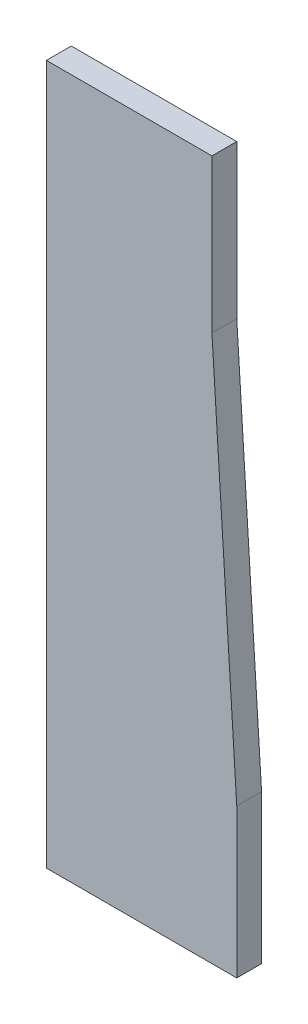
ISO-10303-21;
HEADER;
FILE_DESCRIPTION(('STEP AP214'),'2;1');
FILE_NAME('part.step','',(''),(''),'','','');
FILE_SCHEMA(('AUTOMOTIVE_DESIGN { 1 0 10303 214 1 1 1 1 }'));
ENDSEC;
DATA;
#1=APPLICATION_CONTEXT('core data for automotive mechanical design processes');
#2=APPLICATION_PROTOCOL_DEFINITION('international standard','automotive_design',2000,#1);
#3=PRODUCT_CONTEXT('',#1,'mechanical');
#4=PRODUCT('Part','Part','',(#3));
#5=PRODUCT_RELATED_PRODUCT_CATEGORY('part','',(#4));
#6=PRODUCT_DEFINITION_FORMATION('','',#4);
#7=PRODUCT_DEFINITION_CONTEXT('part definition',#1,'design');
#8=PRODUCT_DEFINITION('design','',#6,#7);
#9=PRODUCT_DEFINITION_SHAPE('','',#8);
#10=(LENGTH_UNIT() NAMED_UNIT(*) SI_UNIT(.MILLI.,.METRE.));
#11=(NAMED_UNIT(*) PLANE_ANGLE_UNIT() SI_UNIT($,.RADIAN.));
#12=(NAMED_UNIT(*) SI_UNIT($,.STERADIAN.) SOLID_ANGLE_UNIT());
#13=UNCERTAINTY_MEASURE_WITH_UNIT(LENGTH_MEASURE(1.E-05),#10,'distance_accuracy_value','');
#14=(GEOMETRIC_REPRESENTATION_CONTEXT(3) GLOBAL_UNCERTAINTY_ASSIGNED_CONTEXT((#13)) GLOBAL_UNIT_ASSIGNED_CONTEXT((#10,
#11,#12)) REPRESENTATION_CONTEXT('',''));
#15=CARTESIAN_POINT('',(0.,0.,0.));
#16=DIRECTION('',(0.,0.,1.));
#17=DIRECTION('',(1.,0.,0.));
#18=AXIS2_PLACEMENT_3D('',#15,#16,#17);
#19=CARTESIAN_POINT('',(209.03946,-5040.33140744906,19.05));
#20=DIRECTION('',(0.,-1.,0.));
#21=DIRECTION('',(0.,0.,-1.));
#22=AXIS2_PLACEMENT_3D('',#19,#20,#21);
#23=PLANE('',#22);
#24=DIRECTION('',(-1.,0.,0.));
#25=VECTOR('',#24,1.);
#26=CARTESIAN_POINT('',(209.03946,-5040.33140744906,0.));
#27=LINE('',#26,#25);
#28=CARTESIAN_POINT('',(209.03946,-5040.33140744906,0.));
#29=VERTEX_POINT('',#28);
#30=CARTESIAN_POINT('',(82.03946,-5040.33140744906,0.));
#31=VERTEX_POINT('',#30);
#32=EDGE_CURVE('E117',#29,#31,#27,.T.);
#33=ORIENTED_EDGE('',*,*,#32,.T.);
#34=DIRECTION('',(0.,0.,-1.));
#35=VECTOR('',#34,1.);
#36=CARTESIAN_POINT('',(82.03946,-5040.33140744906,19.05));
#37=LINE('',#36,#35);
#38=CARTESIAN_POINT('',(82.03946,-5040.33140744906,19.05));
#39=VERTEX_POINT('',#38);
#40=EDGE_CURVE('E11',#39,#31,#37,.T.);
#41=ORIENTED_EDGE('',*,*,#40,.F.);
#42=DIRECTION('',(-1.,0.,0.));
#43=VECTOR('',#42,1.);
#44=CARTESIAN_POINT('',(209.03946,-5040.33140744906,19.05));
#45=LINE('',#44,#43);
#46=CARTESIAN_POINT('',(209.03946,-5040.33140744906,19.05));
#47=VERTEX_POINT('',#46);
#48=EDGE_CURVE('E127',#47,#39,#45,.T.);
#49=ORIENTED_EDGE('',*,*,#48,.F.);
#50=DIRECTION('',(0.,0.,-1.));
#51=VECTOR('',#50,1.);
#52=CARTESIAN_POINT('',(209.03946,-5040.33140744906,19.05));
#53=LINE('',#52,#51);
#54=EDGE_CURVE('E113',#47,#29,#53,.T.);
#55=ORIENTED_EDGE('',*,*,#54,.T.);
#56=EDGE_LOOP('',(#33,#41,#49,#55));
#57=FACE_BOUND('',#56,.T.);
#58=ADVANCED_FACE('F33',(#57),#23,.F.);
#59=CARTESIAN_POINT('',(82.03946,-5040.33140744906,19.05));
#60=DIRECTION('',(1.,0.,0.));
#61=DIRECTION('',(0.,1.,0.));
#62=AXIS2_PLACEMENT_3D('',#59,#60,#61);
#63=PLANE('',#62);
#64=DIRECTION('',(0.,-1.,0.));
#65=VECTOR('',#64,1.);
#66=CARTESIAN_POINT('',(82.03946,-5040.33140744906,0.));
#67=LINE('',#66,#65);
#68=CARTESIAN_POINT('',(82.0394600000001,-5577.12953057513,0.));
#69=VERTEX_POINT('',#68);
#70=EDGE_CURVE('E120',#31,#69,#67,.T.);
#71=ORIENTED_EDGE('',*,*,#70,.T.);
#72=DIRECTION('',(0.,0.,-1.));
#73=VECTOR('',#72,1.);
#74=CARTESIAN_POINT('',(82.0394600000001,-5577.12953057513,19.05));
#75=LINE('',#74,#73);
#76=CARTESIAN_POINT('',(82.0394600000001,-5577.12953057513,19.05));
#77=VERTEX_POINT('',#76);
#78=EDGE_CURVE('E41',#77,#69,#75,.T.);
#79=ORIENTED_EDGE('',*,*,#78,.F.);
#80=DIRECTION('',(0.,-1.,0.));
#81=VECTOR('',#80,1.);
#82=CARTESIAN_POINT('',(82.03946,-5040.33140744906,19.05));
#83=LINE('',#82,#81);
#84=EDGE_CURVE('E86',#39,#77,#83,.T.);
#85=ORIENTED_EDGE('',*,*,#84,.F.);
#86=ORIENTED_EDGE('',*,*,#40,.T.);
#87=EDGE_LOOP('',(#71,#79,#85,#86));
#88=FACE_BOUND('',#87,.T.);
#89=ADVANCED_FACE('F151',(#88),#63,.F.);
#90=CARTESIAN_POINT('',(82.0394600000001,-5577.12953057513,19.05));
#91=DIRECTION('',(0.,1.,0.));
#92=DIRECTION('',(0.,0.,1.));
#93=AXIS2_PLACEMENT_3D('',#90,#91,#92);
#94=PLANE('',#93);
#95=DIRECTION('',(1.,0.,0.));
#96=VECTOR('',#95,1.);
#97=CARTESIAN_POINT('',(82.0394600000001,-5577.12953057513,0.));
#98=LINE('',#97,#96);
#99=CARTESIAN_POINT('',(228.088766336441,-5577.12953057513,0.));
#100=VERTEX_POINT('',#99);
#101=EDGE_CURVE('E122',#69,#100,#98,.T.);
#102=ORIENTED_EDGE('',*,*,#101,.T.);
#103=DIRECTION('',(0.,0.,-1.));
#104=VECTOR('',#103,1.);
#105=CARTESIAN_POINT('',(228.088766336441,-5577.12953057513,19.05));
#106=LINE('',#105,#104);
#107=CARTESIAN_POINT('',(228.088766336441,-5577.12953057513,19.05));
#108=VERTEX_POINT('',#107);
#109=EDGE_CURVE('E108',#108,#100,#106,.T.);
#110=ORIENTED_EDGE('',*,*,#109,.F.);
#111=DIRECTION('',(1.,0.,0.));
#112=VECTOR('',#111,1.);
#113=CARTESIAN_POINT('',(82.0394600000001,-5577.12953057513,19.05));
#114=LINE('',#113,#112);
#115=EDGE_CURVE('E99',#77,#108,#114,.T.);
#116=ORIENTED_EDGE('',*,*,#115,.F.);
#117=ORIENTED_EDGE('',*,*,#78,.T.);
#118=EDGE_LOOP('',(#102,#110,#116,#117));
#119=FACE_BOUND('',#118,.T.);
#120=ADVANCED_FACE('F133',(#119),#94,.F.);
#121=CARTESIAN_POINT('',(228.088766336441,-5577.12953057513,19.05));
#122=DIRECTION('',(-1.,0.,0.));
#123=DIRECTION('',(0.,0.,1.));
#124=AXIS2_PLACEMENT_3D('',#121,#122,#123);
#125=PLANE('',#124);
#126=DIRECTION('',(0.,1.,0.));
#127=VECTOR('',#126,1.);
#128=CARTESIAN_POINT('',(228.088766336441,-5577.12953057513,0.));
#129=LINE('',#128,#127);
#130=CARTESIAN_POINT('',(228.088766336441,-5462.79467174804,0.));
#131=VERTEX_POINT('',#130);
#132=EDGE_CURVE('E107',#100,#131,#129,.T.);
#133=ORIENTED_EDGE('',*,*,#132,.T.);
#134=DIRECTION('',(0.,0.,-1.));
#135=VECTOR('',#134,1.);
#136=CARTESIAN_POINT('',(228.088766336441,-5462.79467174804,19.05));
#137=LINE('',#136,#135);
#138=CARTESIAN_POINT('',(228.088766336441,-5462.79467174804,19.05));
#139=VERTEX_POINT('',#138);
#140=EDGE_CURVE('E104',#139,#131,#137,.T.);
#141=ORIENTED_EDGE('',*,*,#140,.F.);
#142=DIRECTION('',(0.,1.,0.));
#143=VECTOR('',#142,1.);
#144=CARTESIAN_POINT('',(228.088766336441,-5577.12953057513,19.05));
#145=LINE('',#144,#143);
#146=EDGE_CURVE('E93',#108,#139,#145,.T.);
#147=ORIENTED_EDGE('',*,*,#146,.F.);
#148=ORIENTED_EDGE('',*,*,#109,.T.);
#149=EDGE_LOOP('',(#133,#141,#147,#148));
#150=FACE_BOUND('',#149,.T.);
#151=ADVANCED_FACE('F105',(#150),#125,.F.);
#152=CARTESIAN_POINT('',(228.088766336441,-5462.79467174804,19.05));
#153=DIRECTION('',(-0.998052578482889,-0.0623782861551806,0.));
#154=DIRECTION('',(0.0623782861551806,-0.998052578482889,0.));
#155=AXIS2_PLACEMENT_3D('',#152,#153,#154);
#156=PLANE('',#155);
#157=DIRECTION('',(-0.0623782861551806,0.998052578482889,0.));
#158=VECTOR('',#157,1.);
#159=CARTESIAN_POINT('',(228.088766336441,-5462.79467174804,0.));
#160=LINE('',#159,#158);
#161=CARTESIAN_POINT('',(209.03946,-5158.00577036498,0.));
#162=VERTEX_POINT('',#161);
#163=EDGE_CURVE('E72',#131,#162,#160,.T.);
#164=ORIENTED_EDGE('',*,*,#163,.T.);
#165=DIRECTION('',(0.,0.,-1.));
#166=VECTOR('',#165,1.);
#167=CARTESIAN_POINT('',(209.03946,-5158.00577036498,19.05));
#168=LINE('',#167,#166);
#169=CARTESIAN_POINT('',(209.03946,-5158.00577036498,19.05));
#170=VERTEX_POINT('',#169);
#171=EDGE_CURVE('E109',#170,#162,#168,.T.);
#172=ORIENTED_EDGE('',*,*,#171,.F.);
#173=DIRECTION('',(-0.0623782861551806,0.998052578482889,0.));
#174=VECTOR('',#173,1.);
#175=CARTESIAN_POINT('',(228.088766336441,-5462.79467174804,19.05));
#176=LINE('',#175,#174);
#177=EDGE_CURVE('E97',#139,#170,#176,.T.);
#178=ORIENTED_EDGE('',*,*,#177,.F.);
#179=ORIENTED_EDGE('',*,*,#140,.T.);
#180=EDGE_LOOP('',(#164,#172,#178,#179));
#181=FACE_BOUND('',#180,.T.);
#182=ADVANCED_FACE('F111',(#181),#156,.F.);
#183=CARTESIAN_POINT('',(209.03946,-5158.00577036498,19.05));
#184=DIRECTION('',(-1.,0.,0.));
#185=DIRECTION('',(0.,0.,1.));
#186=AXIS2_PLACEMENT_3D('',#183,#184,#185);
#187=PLANE('',#186);
#188=DIRECTION('',(0.,1.,0.));
#189=VECTOR('',#188,1.);
#190=CARTESIAN_POINT('',(209.03946,-5158.00577036498,0.));
#191=LINE('',#190,#189);
#192=EDGE_CURVE('E78',#162,#29,#191,.T.);
#193=ORIENTED_EDGE('',*,*,#192,.T.);
#194=ORIENTED_EDGE('',*,*,#54,.F.);
#195=DIRECTION('',(0.,1.,0.));
#196=VECTOR('',#195,1.);
#197=CARTESIAN_POINT('',(209.03946,-5158.00577036498,19.05));
#198=LINE('',#197,#196);
#199=EDGE_CURVE('E49',#170,#47,#198,.T.);
#200=ORIENTED_EDGE('',*,*,#199,.F.);
#201=ORIENTED_EDGE('',*,*,#171,.T.);
#202=EDGE_LOOP('',(#193,#194,#200,#201));
#203=FACE_BOUND('',#202,.T.);
#204=ADVANCED_FACE('F140',(#203),#187,.F.);
#205=CARTESIAN_POINT('',(0.,0.,19.05));
#206=DIRECTION('',(0.,0.,1.));
#207=DIRECTION('',(1.,0.,0.));
#208=AXIS2_PLACEMENT_3D('',#205,#206,#207);
#209=PLANE('',#208);
#210=ORIENTED_EDGE('',*,*,#48,.T.);
#211=ORIENTED_EDGE('',*,*,#84,.T.);
#212=ORIENTED_EDGE('',*,*,#115,.T.);
#213=ORIENTED_EDGE('',*,*,#146,.T.);
#214=ORIENTED_EDGE('',*,*,#177,.T.);
#215=ORIENTED_EDGE('',*,*,#199,.T.);
#216=EDGE_LOOP('',(#210,#211,#212,#213,#214,#215));
#217=FACE_BOUND('',#216,.T.);
#218=ADVANCED_FACE('F95',(#217),#209,.T.);
#219=CARTESIAN_POINT('',(0.,0.,0.));
#220=DIRECTION('',(0.,0.,1.));
#221=DIRECTION('',(1.,0.,0.));
#222=AXIS2_PLACEMENT_3D('',#219,#220,#221);
#223=PLANE('',#222);
#224=ORIENTED_EDGE('',*,*,#32,.F.);
#225=ORIENTED_EDGE('',*,*,#192,.F.);
#226=ORIENTED_EDGE('',*,*,#163,.F.);
#227=ORIENTED_EDGE('',*,*,#132,.F.);
#228=ORIENTED_EDGE('',*,*,#101,.F.);
#229=ORIENTED_EDGE('',*,*,#70,.F.);
#230=EDGE_LOOP('',(#224,#225,#226,#227,#228,#229));
#231=FACE_BOUND('',#230,.T.);
#232=ADVANCED_FACE('F136',(#231),#223,.F.);
#233=CLOSED_SHELL('',(#58,#89,#120,#151,#182,#204,#218,#232));
#234=MANIFOLD_SOLID_BREP('B2',#233);
#235=ADVANCED_BREP_SHAPE_REPRESENTATION('',(#18,#234),#14);
#236=SHAPE_DEFINITION_REPRESENTATION(#9,#235);
ENDSEC;
END-ISO-10303-21;
